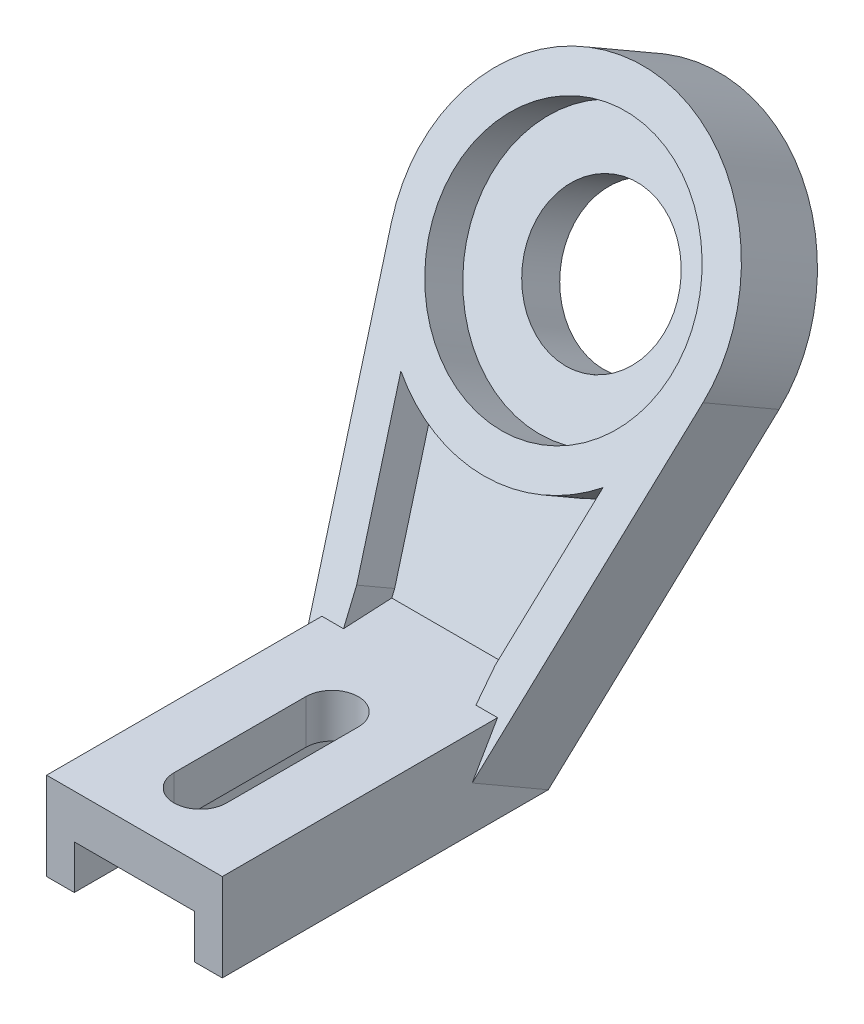
ISO-10303-21;
HEADER;
FILE_DESCRIPTION(('STEP AP214'),'2;1');
FILE_NAME('part.step','',(''),(''),'','','');
FILE_SCHEMA(('AUTOMOTIVE_DESIGN { 1 0 10303 214 1 1 1 1 }'));
ENDSEC;
DATA;
#1=APPLICATION_CONTEXT('core data for automotive mechanical design processes');
#2=APPLICATION_PROTOCOL_DEFINITION('international standard','automotive_design',2000,#1);
#3=PRODUCT_CONTEXT('',#1,'mechanical');
#4=PRODUCT('Part','Part','',(#3));
#5=PRODUCT_RELATED_PRODUCT_CATEGORY('part','',(#4));
#6=PRODUCT_DEFINITION_FORMATION('','',#4);
#7=PRODUCT_DEFINITION_CONTEXT('part definition',#1,'design');
#8=PRODUCT_DEFINITION('design','',#6,#7);
#9=PRODUCT_DEFINITION_SHAPE('','',#8);
#10=(LENGTH_UNIT() NAMED_UNIT(*) SI_UNIT(.MILLI.,.METRE.));
#11=(NAMED_UNIT(*) PLANE_ANGLE_UNIT() SI_UNIT($,.RADIAN.));
#12=(NAMED_UNIT(*) SI_UNIT($,.STERADIAN.) SOLID_ANGLE_UNIT());
#13=UNCERTAINTY_MEASURE_WITH_UNIT(LENGTH_MEASURE(1.E-05),#10,'distance_accuracy_value','');
#14=(GEOMETRIC_REPRESENTATION_CONTEXT(3) GLOBAL_UNCERTAINTY_ASSIGNED_CONTEXT((#13)) GLOBAL_UNIT_ASSIGNED_CONTEXT((#10,
#11,#12)) REPRESENTATION_CONTEXT('',''));
#15=CARTESIAN_POINT('',(0.,0.,0.));
#16=DIRECTION('',(0.,0.,1.));
#17=DIRECTION('',(1.,0.,0.));
#18=AXIS2_PLACEMENT_3D('',#15,#16,#17);
#19=CARTESIAN_POINT('',(-6.35000000000001,29.0838065701559,-38.5253693429844));
#20=DIRECTION('',(0.,-0.500000000000001,-0.866025403784438));
#21=DIRECTION('',(0.,0.866025403784438,-0.500000000000001));
#22=AXIS2_PLACEMENT_3D('',#19,#20,#21);
#23=PLANE('',#22);
#24=CARTESIAN_POINT('',(0.,20.8349145991091,-33.7628693429844));
#25=DIRECTION('',(0.,0.500000000000001,0.866025403784438));
#26=DIRECTION('',(0.,-0.866025403784438,0.500000000000001));
#27=AXIS2_PLACEMENT_3D('',#24,#25,#26);
#28=CIRCLE('',#27,5.15873999999999);
#29=CARTESIAN_POINT('',(0.,16.3673147075902,-31.1834993429844));
#30=VERTEX_POINT('',#29);
#31=EDGE_CURVE('E330',#30,#30,#28,.T.);
#32=ORIENTED_EDGE('',*,*,#31,.F.);
#33=EDGE_LOOP('',(#32));
#34=FACE_BOUND('',#33,.T.);
#35=CARTESIAN_POINT('',(0.,20.8349145991091,-33.7628693429844));
#36=DIRECTION('',(0.,0.500000000000001,0.866025403784438));
#37=DIRECTION('',(0.,-0.866025403784438,0.500000000000001));
#38=AXIS2_PLACEMENT_3D('',#35,#36,#37);
#39=CIRCLE('',#38,8.96874);
#40=CARTESIAN_POINT('',(0.,13.0677579191715,-29.2784993429844));
#41=VERTEX_POINT('',#40);
#42=EDGE_CURVE('E211',#41,#41,#39,.T.);
#43=ORIENTED_EDGE('',*,*,#42,.T.);
#44=EDGE_LOOP('',(#43));
#45=FACE_BOUND('',#44,.T.);
#46=ADVANCED_FACE('F34',(#34,#45),#23,.F.);
#47=CARTESIAN_POINT('',(0.,3.63240390733492,-63.5584918788841));
#48=DIRECTION('',(0.,0.500000000000001,0.866025403784438));
#49=DIRECTION('',(0.,-0.866025403784438,0.500000000000001));
#50=AXIS2_PLACEMENT_3D('',#47,#48,#49);
#51=CYLINDRICAL_SURFACE('',#50,11.50874);
#52=DIRECTION('',(0.,-0.500000000000001,-0.866025403784438));
#53=VECTOR('',#52,1.);
#54=CARTESIAN_POINT('',(-11.2656976899861,30.8205725014422,-11.7618217825945));
#55=LINE('',#54,#53);
#56=CARTESIAN_POINT('',(-11.2656976899861,20.3849249772753,-29.836893504332));
#57=VERTEX_POINT('',#56);
#58=CARTESIAN_POINT('',(-11.2656976899861,17.2099249772753,-35.3361548183632));
#59=VERTEX_POINT('',#58);
#60=EDGE_CURVE('E177',#57,#59,#55,.T.);
#61=ORIENTED_EDGE('',*,*,#60,.F.);
#62=CARTESIAN_POINT('',(0.,22.4224145991091,-31.0132386859688));
#63=DIRECTION('',(0.,0.500000000000001,0.866025403784438));
#64=DIRECTION('',(0.,-0.866025403784438,0.500000000000001));
#65=AXIS2_PLACEMENT_3D('',#62,#63,#64);
#66=CIRCLE('',#65,11.50874);
#67=CARTESIAN_POINT('',(11.2656976899861,20.3849249772753,-29.836893504332));
#68=VERTEX_POINT('',#67);
#69=EDGE_CURVE('E182',#68,#57,#66,.T.);
#70=ORIENTED_EDGE('',*,*,#69,.F.);
#71=DIRECTION('',(0.,-0.500000000000001,-0.866025403784438));
#72=VECTOR('',#71,1.);
#73=CARTESIAN_POINT('',(11.2656976899861,30.8205725014422,-11.7618217825946));
#74=LINE('',#73,#72);
#75=CARTESIAN_POINT('',(11.2656976899861,17.2099249772753,-35.3361548183632));
#76=VERTEX_POINT('',#75);
#77=EDGE_CURVE('E261',#68,#76,#74,.T.);
#78=ORIENTED_EDGE('',*,*,#77,.T.);
#79=CARTESIAN_POINT('',(0.,19.2474145991091,-36.5125));
#80=DIRECTION('',(0.,0.500000000000001,0.866025403784438));
#81=DIRECTION('',(0.,-0.866025403784438,0.500000000000001));
#82=AXIS2_PLACEMENT_3D('',#79,#80,#81);
#83=CIRCLE('',#82,11.50874);
#84=EDGE_CURVE('E183',#59,#76,#83,.F.);
#85=ORIENTED_EDGE('',*,*,#84,.F.);
#86=EDGE_LOOP('',(#61,#70,#78,#85));
#87=FACE_BOUND('',#86,.T.);
#88=ADVANCED_FACE('F179',(#87),#51,.T.);
#89=CARTESIAN_POINT('',(0.,0.,0.));
#90=DIRECTION('',(0.,1.,0.));
#91=DIRECTION('',(0.,0.,1.));
#92=AXIS2_PLACEMENT_3D('',#89,#90,#91);
#93=PLANE('',#92);
#94=DIRECTION('',(0.,0.,-1.));
#95=VECTOR('',#94,1.);
#96=CARTESIAN_POINT('',(1.89865,0.,-14.2875));
#97=LINE('',#96,#95);
#98=CARTESIAN_POINT('',(1.89865,0.,-4.7625));
#99=VERTEX_POINT('',#98);
#100=CARTESIAN_POINT('',(1.89865,0.,-14.2875));
#101=VERTEX_POINT('',#100);
#102=EDGE_CURVE('E308',#99,#101,#97,.T.);
#103=ORIENTED_EDGE('',*,*,#102,.T.);
#104=CARTESIAN_POINT('',(0.,0.,-14.2875));
#105=DIRECTION('',(0.,1.,0.));
#106=DIRECTION('',(0.,0.,1.));
#107=AXIS2_PLACEMENT_3D('',#104,#105,#106);
#108=CIRCLE('',#107,1.89865);
#109=CARTESIAN_POINT('',(-1.89865,0.,-14.2875));
#110=VERTEX_POINT('',#109);
#111=EDGE_CURVE('E298',#101,#110,#108,.T.);
#112=ORIENTED_EDGE('',*,*,#111,.T.);
#113=DIRECTION('',(0.,0.,1.));
#114=VECTOR('',#113,1.);
#115=CARTESIAN_POINT('',(-1.89865,0.,-14.2875));
#116=LINE('',#115,#114);
#117=CARTESIAN_POINT('',(-1.89865,0.,-4.7625));
#118=VERTEX_POINT('',#117);
#119=EDGE_CURVE('E301',#110,#118,#116,.T.);
#120=ORIENTED_EDGE('',*,*,#119,.T.);
#121=CARTESIAN_POINT('',(0.,0.,-4.7625));
#122=DIRECTION('',(0.,1.,0.));
#123=DIRECTION('',(0.,0.,1.));
#124=AXIS2_PLACEMENT_3D('',#121,#122,#123);
#125=CIRCLE('',#124,1.89865);
#126=EDGE_CURVE('E305',#118,#99,#125,.T.);
#127=ORIENTED_EDGE('',*,*,#126,.T.);
#128=EDGE_LOOP('',(#103,#112,#120,#127));
#129=FACE_BOUND('',#128,.T.);
#130=DIRECTION('',(0.,0.,-1.));
#131=VECTOR('',#130,1.);
#132=CARTESIAN_POINT('',(4.34975,0.,0.));
#133=LINE('',#132,#131);
#134=CARTESIAN_POINT('',(4.34975,0.,0.));
#135=VERTEX_POINT('',#134);
#136=CARTESIAN_POINT('',(4.34975,0.,-25.4));
#137=VERTEX_POINT('',#136);
#138=EDGE_CURVE('E287',#135,#137,#133,.T.);
#139=ORIENTED_EDGE('',*,*,#138,.F.);
#140=DIRECTION('',(1.,0.,0.));
#141=VECTOR('',#140,1.);
#142=CARTESIAN_POINT('',(-6.35,0.,0.));
#143=LINE('',#142,#141);
#144=CARTESIAN_POINT('',(-4.34975,0.,0.));
#145=VERTEX_POINT('',#144);
#146=EDGE_CURVE('E342',#145,#135,#143,.T.);
#147=ORIENTED_EDGE('',*,*,#146,.F.);
#148=DIRECTION('',(0.,0.,1.));
#149=VECTOR('',#148,1.);
#150=CARTESIAN_POINT('',(-4.34975,0.,0.));
#151=LINE('',#150,#149);
#152=CARTESIAN_POINT('',(-4.34975,0.,-25.4));
#153=VERTEX_POINT('',#152);
#154=EDGE_CURVE('E292',#153,#145,#151,.T.);
#155=ORIENTED_EDGE('',*,*,#154,.F.);
#156=DIRECTION('',(-1.,0.,0.));
#157=VECTOR('',#156,1.);
#158=CARTESIAN_POINT('',(-6.35,0.,-25.4));
#159=LINE('',#158,#157);
#160=EDGE_CURVE('E337',#137,#153,#159,.T.);
#161=ORIENTED_EDGE('',*,*,#160,.F.);
#162=EDGE_LOOP('',(#139,#147,#155,#161));
#163=FACE_BOUND('',#162,.T.);
#164=ADVANCED_FACE('F370',(#129,#163),#93,.F.);
#165=CARTESIAN_POINT('',(0.,3.175,0.));
#166=DIRECTION('',(0.,1.,0.));
#167=DIRECTION('',(0.,0.,1.));
#168=AXIS2_PLACEMENT_3D('',#165,#166,#167);
#169=PLANE('',#168);
#170=DIRECTION('',(1.,0.,0.));
#171=VECTOR('',#170,1.);
#172=CARTESIAN_POINT('',(0.,3.175,-19.9007386859688));
#173=LINE('',#172,#171);
#174=CARTESIAN_POINT('',(-6.35,3.175,-19.9007386859688));
#175=VERTEX_POINT('',#174);
#176=CARTESIAN_POINT('',(-4.78565932002867,3.175,-19.9007386859688));
#177=VERTEX_POINT('',#176);
#178=EDGE_CURVE('E254',#175,#177,#173,.T.);
#179=ORIENTED_EDGE('',*,*,#178,.F.);
#180=DIRECTION('',(0.,0.,1.));
#181=VECTOR('',#180,1.);
#182=CARTESIAN_POINT('',(-6.35,3.175,-25.4));
#183=LINE('',#182,#181);
#184=CARTESIAN_POINT('',(-6.35,3.175,0.));
#185=VERTEX_POINT('',#184);
#186=EDGE_CURVE('E334',#175,#185,#183,.T.);
#187=ORIENTED_EDGE('',*,*,#186,.T.);
#188=DIRECTION('',(1.,0.,0.));
#189=VECTOR('',#188,1.);
#190=CARTESIAN_POINT('',(-6.35,3.175,0.));
#191=LINE('',#190,#189);
#192=CARTESIAN_POINT('',(6.35,3.175,0.));
#193=VERTEX_POINT('',#192);
#194=EDGE_CURVE('E336',#185,#193,#191,.T.);
#195=ORIENTED_EDGE('',*,*,#194,.T.);
#196=DIRECTION('',(0.,0.,-1.));
#197=VECTOR('',#196,1.);
#198=CARTESIAN_POINT('',(6.34999999999999,3.175,-25.4));
#199=LINE('',#198,#197);
#200=CARTESIAN_POINT('',(6.35,3.175,-19.9007386859688));
#201=VERTEX_POINT('',#200);
#202=EDGE_CURVE('E339',#193,#201,#199,.T.);
#203=ORIENTED_EDGE('',*,*,#202,.T.);
#204=CARTESIAN_POINT('',(4.78565932002866,3.175,-19.9007386859688));
#205=VERTEX_POINT('',#204);
#206=EDGE_CURVE('E56',#205,#201,#173,.T.);
#207=ORIENTED_EDGE('',*,*,#206,.F.);
#208=DIRECTION('',(0.0479288249038852,0.,-0.998850753487893));
#209=VECTOR('',#208,1.);
#210=CARTESIAN_POINT('',(3.8219429894529,3.175,0.18339199894926));
#211=LINE('',#210,#209);
#212=CARTESIAN_POINT('',(4.96157691445774,3.17499999999999,-23.5669128953229));
#213=VERTEX_POINT('',#212);
#214=EDGE_CURVE('E249',#205,#213,#211,.T.);
#215=ORIENTED_EDGE('',*,*,#214,.T.);
#216=DIRECTION('',(-1.,0.,0.));
#217=VECTOR('',#216,1.);
#218=CARTESIAN_POINT('',(0.,3.175,-23.5669128953229));
#219=LINE('',#218,#217);
#220=CARTESIAN_POINT('',(-4.96157691445776,3.17499999999999,-23.5669128953229));
#221=VERTEX_POINT('',#220);
#222=EDGE_CURVE('E352',#213,#221,#219,.T.);
#223=ORIENTED_EDGE('',*,*,#222,.T.);
#224=DIRECTION('',(0.0479288249038846,0.,0.998850753487894));
#225=VECTOR('',#224,1.);
#226=CARTESIAN_POINT('',(-3.82194298945292,3.175,0.183391998949259));
#227=LINE('',#226,#225);
#228=EDGE_CURVE('E49',#221,#177,#227,.T.);
#229=ORIENTED_EDGE('',*,*,#228,.T.);
#230=EDGE_LOOP('',(#179,#187,#195,#203,#207,#215,#223,#229));
#231=FACE_BOUND('',#230,.T.);
#232=CARTESIAN_POINT('',(0.,3.175,-14.2875));
#233=DIRECTION('',(0.,1.,0.));
#234=DIRECTION('',(0.,0.,1.));
#235=AXIS2_PLACEMENT_3D('',#232,#233,#234);
#236=CIRCLE('',#235,1.89865);
#237=CARTESIAN_POINT('',(1.89865,3.175,-14.2875));
#238=VERTEX_POINT('',#237);
#239=CARTESIAN_POINT('',(-1.89865,3.175,-14.2875));
#240=VERTEX_POINT('',#239);
#241=EDGE_CURVE('E297',#238,#240,#236,.T.);
#242=ORIENTED_EDGE('',*,*,#241,.F.);
#243=DIRECTION('',(0.,0.,-1.));
#244=VECTOR('',#243,1.);
#245=CARTESIAN_POINT('',(1.89865,3.175,-14.2875));
#246=LINE('',#245,#244);
#247=CARTESIAN_POINT('',(1.89865,3.175,-4.7625));
#248=VERTEX_POINT('',#247);
#249=EDGE_CURVE('E302',#248,#238,#246,.T.);
#250=ORIENTED_EDGE('',*,*,#249,.F.);
#251=CARTESIAN_POINT('',(0.,3.175,-4.7625));
#252=DIRECTION('',(0.,1.,0.));
#253=DIRECTION('',(0.,0.,1.));
#254=AXIS2_PLACEMENT_3D('',#251,#252,#253);
#255=CIRCLE('',#254,1.89865);
#256=CARTESIAN_POINT('',(-1.89865,3.175,-4.7625));
#257=VERTEX_POINT('',#256);
#258=EDGE_CURVE('E316',#257,#248,#255,.T.);
#259=ORIENTED_EDGE('',*,*,#258,.F.);
#260=DIRECTION('',(0.,0.,1.));
#261=VECTOR('',#260,1.);
#262=CARTESIAN_POINT('',(-1.89865,3.175,-14.2875));
#263=LINE('',#262,#261);
#264=EDGE_CURVE('E313',#240,#257,#263,.T.);
#265=ORIENTED_EDGE('',*,*,#264,.F.);
#266=EDGE_LOOP('',(#242,#250,#259,#265));
#267=FACE_BOUND('',#266,.T.);
#268=ADVANCED_FACE('F423',(#231,#267),#169,.T.);
#269=CARTESIAN_POINT('',(-6.35,3.175,-25.4));
#270=DIRECTION('',(1.,0.,0.));
#271=DIRECTION('',(0.,0.,-1.));
#272=AXIS2_PLACEMENT_3D('',#269,#270,#271);
#273=PLANE('',#272);
#274=ORIENTED_EDGE('',*,*,#186,.F.);
#275=DIRECTION('',(0.,-0.866025403784438,0.500000000000001));
#276=VECTOR('',#275,1.);
#277=CARTESIAN_POINT('',(-6.35,5.55625000000001,-21.2755540144766));
#278=LINE('',#277,#276);
#279=CARTESIAN_POINT('',(-6.35,0.,-18.0676515812918));
#280=VERTEX_POINT('',#279);
#281=EDGE_CURVE('E253',#175,#280,#278,.T.);
#282=ORIENTED_EDGE('',*,*,#281,.T.);
#283=DIRECTION('',(0.,-0.500000000000001,-0.866025403784438));
#284=VECTOR('',#283,1.);
#285=CARTESIAN_POINT('',(-6.34999999999999,10.435647524167,0.0074201404456839));
#286=LINE('',#285,#284);
#287=CARTESIAN_POINT('',(-6.35,-3.17499999999999,-23.5669128953229));
#288=VERTEX_POINT('',#287);
#289=EDGE_CURVE('E188',#280,#288,#286,.T.);
#290=ORIENTED_EDGE('',*,*,#289,.T.);
#291=DIRECTION('',(0.,0.,1.));
#292=VECTOR('',#291,1.);
#293=CARTESIAN_POINT('',(-6.35,-3.175,-25.4));
#294=LINE('',#293,#292);
#295=CARTESIAN_POINT('',(-6.35,-3.175,0.));
#296=VERTEX_POINT('',#295);
#297=EDGE_CURVE('E284',#288,#296,#294,.T.);
#298=ORIENTED_EDGE('',*,*,#297,.T.);
#299=DIRECTION('',(0.,-1.,0.));
#300=VECTOR('',#299,1.);
#301=CARTESIAN_POINT('',(-6.35,3.175,0.));
#302=LINE('',#301,#300);
#303=EDGE_CURVE('E349',#185,#296,#302,.T.);
#304=ORIENTED_EDGE('',*,*,#303,.F.);
#305=EDGE_LOOP('',(#274,#282,#290,#298,#304));
#306=FACE_BOUND('',#305,.T.);
#307=ADVANCED_FACE('F36',(#306),#273,.F.);
#308=CARTESIAN_POINT('',(-6.35,3.175,0.));
#309=DIRECTION('',(0.,0.,-1.));
#310=DIRECTION('',(-1.,0.,0.));
#311=AXIS2_PLACEMENT_3D('',#308,#309,#310);
#312=PLANE('',#311);
#313=ORIENTED_EDGE('',*,*,#303,.T.);
#314=DIRECTION('',(1.,0.,0.));
#315=VECTOR('',#314,1.);
#316=CARTESIAN_POINT('',(-11.50874,-3.175,0.));
#317=LINE('',#316,#315);
#318=CARTESIAN_POINT('',(-4.34975,-3.175,0.));
#319=VERTEX_POINT('',#318);
#320=EDGE_CURVE('E269',#296,#319,#317,.T.);
#321=ORIENTED_EDGE('',*,*,#320,.T.);
#322=DIRECTION('',(0.,1.,0.));
#323=VECTOR('',#322,1.);
#324=CARTESIAN_POINT('',(-4.34975,-18.034,0.));
#325=LINE('',#324,#323);
#326=EDGE_CURVE('E295',#319,#145,#325,.T.);
#327=ORIENTED_EDGE('',*,*,#326,.T.);
#328=ORIENTED_EDGE('',*,*,#146,.T.);
#329=DIRECTION('',(0.,1.,0.));
#330=VECTOR('',#329,1.);
#331=CARTESIAN_POINT('',(4.34975,-18.034,0.));
#332=LINE('',#331,#330);
#333=CARTESIAN_POINT('',(4.34975,-3.175,0.));
#334=VERTEX_POINT('',#333);
#335=EDGE_CURVE('E290',#334,#135,#332,.T.);
#336=ORIENTED_EDGE('',*,*,#335,.F.);
#337=CARTESIAN_POINT('',(6.35,-3.175,0.));
#338=VERTEX_POINT('',#337);
#339=EDGE_CURVE('E266',#334,#338,#317,.T.);
#340=ORIENTED_EDGE('',*,*,#339,.T.);
#341=DIRECTION('',(0.,-1.,0.));
#342=VECTOR('',#341,1.);
#343=CARTESIAN_POINT('',(6.35,3.175,0.));
#344=LINE('',#343,#342);
#345=EDGE_CURVE('E341',#193,#338,#344,.T.);
#346=ORIENTED_EDGE('',*,*,#345,.F.);
#347=ORIENTED_EDGE('',*,*,#194,.F.);
#348=EDGE_LOOP('',(#313,#321,#327,#328,#336,#340,#346,#347));
#349=FACE_BOUND('',#348,.T.);
#350=ADVANCED_FACE('F363',(#349),#312,.F.);
#351=CARTESIAN_POINT('',(6.34999999999999,3.175,-25.4));
#352=DIRECTION('',(-1.,0.,0.));
#353=DIRECTION('',(0.,0.,1.));
#354=AXIS2_PLACEMENT_3D('',#351,#352,#353);
#355=PLANE('',#354);
#356=DIRECTION('',(0.,-0.500000000000001,-0.866025403784438));
#357=VECTOR('',#356,1.);
#358=CARTESIAN_POINT('',(6.35000000000001,10.435647524167,0.00742014044568043));
#359=LINE('',#358,#357);
#360=CARTESIAN_POINT('',(6.35,0.,-18.0676515812918));
#361=VERTEX_POINT('',#360);
#362=CARTESIAN_POINT('',(6.35,-3.17499999999999,-23.5669128953229));
#363=VERTEX_POINT('',#362);
#364=EDGE_CURVE('E262',#361,#363,#359,.T.);
#365=ORIENTED_EDGE('',*,*,#364,.F.);
#366=DIRECTION('',(0.,0.866025403784438,-0.500000000000001));
#367=VECTOR('',#366,1.);
#368=CARTESIAN_POINT('',(6.35,5.55625000000001,-21.2755540144766));
#369=LINE('',#368,#367);
#370=EDGE_CURVE('E11',#361,#201,#369,.T.);
#371=ORIENTED_EDGE('',*,*,#370,.T.);
#372=ORIENTED_EDGE('',*,*,#202,.F.);
#373=ORIENTED_EDGE('',*,*,#345,.T.);
#374=DIRECTION('',(0.,0.,-1.));
#375=VECTOR('',#374,1.);
#376=CARTESIAN_POINT('',(6.34999999999999,-3.175,-25.4));
#377=LINE('',#376,#375);
#378=EDGE_CURVE('E281',#338,#363,#377,.T.);
#379=ORIENTED_EDGE('',*,*,#378,.T.);
#380=EDGE_LOOP('',(#365,#371,#372,#373,#379));
#381=FACE_BOUND('',#380,.T.);
#382=ADVANCED_FACE('F381',(#381),#355,.F.);
#383=DIRECTION('',(-0.0955290449744114,0.862064760429695,-0.497713321492975));
#384=VECTOR('',#383,1.);
#385=CARTESIAN_POINT('',(-5.01082985693095,3.61946404823775,-23.8235243332181));
#386=LINE('',#385,#384);
#387=CARTESIAN_POINT('',(-5.01082985693095,3.61946404823776,-23.8235243332181));
#388=VERTEX_POINT('',#387);
#389=EDGE_CURVE('E226',#221,#388,#386,.T.);
#390=ORIENTED_EDGE('',*,*,#389,.F.);
#391=ORIENTED_EDGE('',*,*,#222,.F.);
#392=DIRECTION('',(-0.0955290449744137,-0.862064760429694,0.497713321492976));
#393=VECTOR('',#392,1.);
#394=CARTESIAN_POINT('',(4.47147286107701,-1.24775366069505,-21.0134348787612));
#395=LINE('',#394,#393);
#396=CARTESIAN_POINT('',(5.01082985693094,3.61946404823775,-23.8235243332181));
#397=VERTEX_POINT('',#396);
#398=EDGE_CURVE('E205',#397,#213,#395,.T.);
#399=ORIENTED_EDGE('',*,*,#398,.F.);
#400=DIRECTION('',(-0.204426406650398,-0.847736623721073,0.489440967907267));
#401=VECTOR('',#400,1.);
#402=CARTESIAN_POINT('',(5.01082985693095,3.61946404823775,-23.8235243332181));
#403=LINE('',#402,#401);
#404=CARTESIAN_POINT('',(7.30501638045674,13.1332346491473,-29.3163023506616));
#405=VERTEX_POINT('',#404);
#406=EDGE_CURVE('E208',#405,#397,#403,.T.);
#407=ORIENTED_EDGE('',*,*,#406,.F.);
#408=CARTESIAN_POINT('',(0.,20.8349145991091,-33.7628693429844));
#409=DIRECTION('',(0.,0.500000000000001,0.866025403784438));
#410=DIRECTION('',(0.,-0.866025403784438,0.500000000000001));
#411=AXIS2_PLACEMENT_3D('',#408,#409,#410);
#412=CIRCLE('',#411,11.50874);
#413=CARTESIAN_POINT('',(-7.30501638045675,13.1332346491473,-29.3163023506616));
#414=VERTEX_POINT('',#413);
#415=EDGE_CURVE('E233',#414,#405,#412,.T.);
#416=ORIENTED_EDGE('',*,*,#415,.F.);
#417=DIRECTION('',(-0.204426406650398,0.847736623721073,-0.489440967907267));
#418=VECTOR('',#417,1.);
#419=CARTESIAN_POINT('',(-7.30501638045675,13.1332346491473,-29.3163023506616));
#420=LINE('',#419,#418);
#421=EDGE_CURVE('E229',#388,#414,#420,.T.);
#422=ORIENTED_EDGE('',*,*,#421,.F.);
#423=EDGE_LOOP('',(#390,#391,#399,#407,#416,#422));
#424=FACE_BOUND('',#423,.T.);
#425=ADVANCED_FACE('F403',(#424),#23,.F.);
#426=CARTESIAN_POINT('',(-6.35000000000001,27.4963065701559,-41.275));
#427=DIRECTION('',(0.,0.500000000000001,0.866025403784438));
#428=DIRECTION('',(0.,-0.866025403784438,0.500000000000001));
#429=AXIS2_PLACEMENT_3D('',#426,#427,#428);
#430=PLANE('',#429);
#431=DIRECTION('',(-0.204426406650398,0.847736623721073,-0.489440967907267));
#432=VECTOR('',#431,1.);
#433=CARTESIAN_POINT('',(-6.35,-3.17499999999999,-23.5669128953229));
#434=LINE('',#433,#432);
#435=EDGE_CURVE('E256',#288,#59,#434,.T.);
#436=ORIENTED_EDGE('',*,*,#435,.T.);
#437=ORIENTED_EDGE('',*,*,#84,.T.);
#438=DIRECTION('',(-0.204426406650398,-0.847736623721073,0.489440967907267));
#439=VECTOR('',#438,1.);
#440=CARTESIAN_POINT('',(6.35,-3.17499999999999,-23.5669128953229));
#441=LINE('',#440,#439);
#442=EDGE_CURVE('E187',#76,#363,#441,.T.);
#443=ORIENTED_EDGE('',*,*,#442,.T.);
#444=DIRECTION('',(1.,0.,0.));
#445=VECTOR('',#444,1.);
#446=CARTESIAN_POINT('',(-11.50874,-3.175,-23.566912895323));
#447=LINE('',#446,#445);
#448=CARTESIAN_POINT('',(4.34975,-3.175,-23.566912895323));
#449=VERTEX_POINT('',#448);
#450=EDGE_CURVE('E264',#449,#363,#447,.T.);
#451=ORIENTED_EDGE('',*,*,#450,.F.);
#452=DIRECTION('',(0.,-0.866025403784441,0.499999999999995));
#453=VECTOR('',#452,1.);
#454=CARTESIAN_POINT('',(4.34975,-24.5240226280624,-11.2410489340759));
#455=LINE('',#454,#453);
#456=EDGE_CURVE('E273',#137,#449,#455,.T.);
#457=ORIENTED_EDGE('',*,*,#456,.F.);
#458=ORIENTED_EDGE('',*,*,#160,.T.);
#459=DIRECTION('',(0.,0.866025403784441,-0.499999999999995));
#460=VECTOR('',#459,1.);
#461=CARTESIAN_POINT('',(-4.34975,-24.5240226280624,-11.2410489340759));
#462=LINE('',#461,#460);
#463=CARTESIAN_POINT('',(-4.34975,-3.175,-23.566912895323));
#464=VERTEX_POINT('',#463);
#465=EDGE_CURVE('E276',#464,#153,#462,.T.);
#466=ORIENTED_EDGE('',*,*,#465,.F.);
#467=EDGE_CURVE('E270',#288,#464,#447,.T.);
#468=ORIENTED_EDGE('',*,*,#467,.F.);
#469=EDGE_LOOP('',(#436,#437,#443,#451,#457,#458,#466,#468));
#470=FACE_BOUND('',#469,.T.);
#471=CARTESIAN_POINT('',(0.,19.2474145991091,-36.5125));
#472=DIRECTION('',(0.,0.500000000000001,0.866025403784438));
#473=DIRECTION('',(0.,-0.866025403784438,0.500000000000001));
#474=AXIS2_PLACEMENT_3D('',#471,#472,#473);
#475=CIRCLE('',#474,5.15873999999999);
#476=CARTESIAN_POINT('',(0.,14.7798147075902,-33.93313));
#477=VERTEX_POINT('',#476);
#478=EDGE_CURVE('E333',#477,#477,#475,.T.);
#479=ORIENTED_EDGE('',*,*,#478,.T.);
#480=EDGE_LOOP('',(#479));
#481=FACE_BOUND('',#480,.T.);
#482=ADVANCED_FACE('F376',(#470,#481),#430,.F.);
#483=CARTESIAN_POINT('',(0.,20.8349145991091,-33.7628693429844));
#484=DIRECTION('',(0.,0.500000000000001,0.866025403784438));
#485=DIRECTION('',(0.,-0.866025403784438,0.500000000000001));
#486=AXIS2_PLACEMENT_3D('',#483,#484,#485);
#487=CYLINDRICAL_SURFACE('',#486,5.15873999999999);
#488=ORIENTED_EDGE('',*,*,#31,.T.);
#489=EDGE_LOOP('',(#488));
#490=FACE_BOUND('',#489,.T.);
#491=ORIENTED_EDGE('',*,*,#478,.F.);
#492=EDGE_LOOP('',(#491));
#493=FACE_BOUND('',#492,.T.);
#494=ADVANCED_FACE('F418',(#490,#493),#487,.F.);
#495=CARTESIAN_POINT('',(0.,0.,-14.2875));
#496=DIRECTION('',(0.,1.,0.));
#497=DIRECTION('',(0.,0.,1.));
#498=AXIS2_PLACEMENT_3D('',#495,#496,#497);
#499=CYLINDRICAL_SURFACE('',#498,1.89865);
#500=ORIENTED_EDGE('',*,*,#241,.T.);
#501=DIRECTION('',(0.,1.,0.));
#502=VECTOR('',#501,1.);
#503=CARTESIAN_POINT('',(-1.89865,0.,-14.2875));
#504=LINE('',#503,#502);
#505=EDGE_CURVE('E311',#110,#240,#504,.T.);
#506=ORIENTED_EDGE('',*,*,#505,.F.);
#507=ORIENTED_EDGE('',*,*,#111,.F.);
#508=DIRECTION('',(0.,1.,0.));
#509=VECTOR('',#508,1.);
#510=CARTESIAN_POINT('',(1.89865,0.,-14.2875));
#511=LINE('',#510,#509);
#512=EDGE_CURVE('E321',#101,#238,#511,.T.);
#513=ORIENTED_EDGE('',*,*,#512,.T.);
#514=EDGE_LOOP('',(#500,#506,#507,#513));
#515=FACE_BOUND('',#514,.T.);
#516=ADVANCED_FACE('F599',(#515),#499,.F.);
#517=CARTESIAN_POINT('',(1.89865,0.,-14.2875));
#518=DIRECTION('',(1.,0.,0.));
#519=DIRECTION('',(0.,0.,-1.));
#520=AXIS2_PLACEMENT_3D('',#517,#518,#519);
#521=PLANE('',#520);
#522=ORIENTED_EDGE('',*,*,#249,.T.);
#523=ORIENTED_EDGE('',*,*,#512,.F.);
#524=ORIENTED_EDGE('',*,*,#102,.F.);
#525=DIRECTION('',(0.,1.,0.));
#526=VECTOR('',#525,1.);
#527=CARTESIAN_POINT('',(1.89865,0.,-4.7625));
#528=LINE('',#527,#526);
#529=EDGE_CURVE('E323',#99,#248,#528,.T.);
#530=ORIENTED_EDGE('',*,*,#529,.T.);
#531=EDGE_LOOP('',(#522,#523,#524,#530));
#532=FACE_BOUND('',#531,.T.);
#533=ADVANCED_FACE('F589',(#532),#521,.F.);
#534=CARTESIAN_POINT('',(0.,0.,-4.7625));
#535=DIRECTION('',(0.,1.,0.));
#536=DIRECTION('',(0.,0.,1.));
#537=AXIS2_PLACEMENT_3D('',#534,#535,#536);
#538=CYLINDRICAL_SURFACE('',#537,1.89865);
#539=ORIENTED_EDGE('',*,*,#258,.T.);
#540=ORIENTED_EDGE('',*,*,#529,.F.);
#541=ORIENTED_EDGE('',*,*,#126,.F.);
#542=DIRECTION('',(0.,1.,0.));
#543=VECTOR('',#542,1.);
#544=CARTESIAN_POINT('',(-1.89865,0.,-4.7625));
#545=LINE('',#544,#543);
#546=EDGE_CURVE('E325',#118,#257,#545,.T.);
#547=ORIENTED_EDGE('',*,*,#546,.T.);
#548=EDGE_LOOP('',(#539,#540,#541,#547));
#549=FACE_BOUND('',#548,.T.);
#550=ADVANCED_FACE('F579',(#549),#538,.F.);
#551=CARTESIAN_POINT('',(-1.89865,0.,-14.2875));
#552=DIRECTION('',(-1.,0.,0.));
#553=DIRECTION('',(0.,0.,1.));
#554=AXIS2_PLACEMENT_3D('',#551,#552,#553);
#555=PLANE('',#554);
#556=ORIENTED_EDGE('',*,*,#264,.T.);
#557=ORIENTED_EDGE('',*,*,#546,.F.);
#558=ORIENTED_EDGE('',*,*,#119,.F.);
#559=ORIENTED_EDGE('',*,*,#505,.T.);
#560=EDGE_LOOP('',(#556,#557,#558,#559));
#561=FACE_BOUND('',#560,.T.);
#562=ADVANCED_FACE('F558',(#561),#555,.F.);
#563=CARTESIAN_POINT('',(-4.34975,-18.034,0.));
#564=DIRECTION('',(-1.,0.,0.));
#565=DIRECTION('',(0.,0.,1.));
#566=AXIS2_PLACEMENT_3D('',#563,#564,#565);
#567=PLANE('',#566);
#568=ORIENTED_EDGE('',*,*,#326,.F.);
#569=DIRECTION('',(0.,0.,-1.));
#570=VECTOR('',#569,1.);
#571=CARTESIAN_POINT('',(-4.34975,-3.175,0.));
#572=LINE('',#571,#570);
#573=EDGE_CURVE('E278',#319,#464,#572,.T.);
#574=ORIENTED_EDGE('',*,*,#573,.T.);
#575=ORIENTED_EDGE('',*,*,#465,.T.);
#576=ORIENTED_EDGE('',*,*,#154,.T.);
#577=EDGE_LOOP('',(#568,#574,#575,#576));
#578=FACE_BOUND('',#577,.T.);
#579=ADVANCED_FACE('F373',(#578),#567,.F.);
#580=CARTESIAN_POINT('',(4.34975,-18.034,0.));
#581=DIRECTION('',(1.,0.,0.));
#582=DIRECTION('',(0.,0.,-1.));
#583=AXIS2_PLACEMENT_3D('',#580,#581,#582);
#584=PLANE('',#583);
#585=ORIENTED_EDGE('',*,*,#456,.T.);
#586=DIRECTION('',(0.,0.,1.));
#587=VECTOR('',#586,1.);
#588=CARTESIAN_POINT('',(4.34975,-3.175,0.));
#589=LINE('',#588,#587);
#590=EDGE_CURVE('E42',#449,#334,#589,.T.);
#591=ORIENTED_EDGE('',*,*,#590,.T.);
#592=ORIENTED_EDGE('',*,*,#335,.T.);
#593=ORIENTED_EDGE('',*,*,#138,.T.);
#594=EDGE_LOOP('',(#585,#591,#592,#593));
#595=FACE_BOUND('',#594,.T.);
#596=ADVANCED_FACE('F358',(#595),#584,.F.);
#597=CARTESIAN_POINT('',(-11.50874,-3.175,0.));
#598=DIRECTION('',(0.,1.,0.));
#599=DIRECTION('',(0.,0.,1.));
#600=AXIS2_PLACEMENT_3D('',#597,#598,#599);
#601=PLANE('',#600);
#602=ORIENTED_EDGE('',*,*,#339,.F.);
#603=ORIENTED_EDGE('',*,*,#590,.F.);
#604=ORIENTED_EDGE('',*,*,#450,.T.);
#605=ORIENTED_EDGE('',*,*,#378,.F.);
#606=EDGE_LOOP('',(#602,#603,#604,#605));
#607=FACE_BOUND('',#606,.T.);
#608=ADVANCED_FACE('F379',(#607),#601,.F.);
#609=ORIENTED_EDGE('',*,*,#467,.T.);
#610=ORIENTED_EDGE('',*,*,#573,.F.);
#611=ORIENTED_EDGE('',*,*,#320,.F.);
#612=ORIENTED_EDGE('',*,*,#297,.F.);
#613=EDGE_LOOP('',(#609,#610,#611,#612));
#614=FACE_BOUND('',#613,.T.);
#615=ADVANCED_FACE('F389',(#614),#601,.F.);
#616=CARTESIAN_POINT('',(6.35000000000001,10.435647524167,0.00742014044568043));
#617=DIRECTION('',(0.978881935814532,-0.177038461363613,0.102213203325199));
#618=DIRECTION('',(0.177970579621201,0.984035808692597,0.));
#619=AXIS2_PLACEMENT_3D('',#616,#617,#618);
#620=PLANE('',#619);
#621=ORIENTED_EDGE('',*,*,#77,.F.);
#622=DIRECTION('',(0.204426406650398,0.847736623721073,-0.489440967907267));
#623=VECTOR('',#622,1.);
#624=CARTESIAN_POINT('',(6.35,0.,-18.0676515812918));
#625=LINE('',#624,#623);
#626=EDGE_CURVE('E204',#361,#68,#625,.T.);
#627=ORIENTED_EDGE('',*,*,#626,.F.);
#628=ORIENTED_EDGE('',*,*,#364,.T.);
#629=ORIENTED_EDGE('',*,*,#442,.F.);
#630=EDGE_LOOP('',(#621,#627,#628,#629));
#631=FACE_BOUND('',#630,.T.);
#632=ADVANCED_FACE('F391',(#631),#620,.T.);
#633=CARTESIAN_POINT('',(-6.34999999999999,10.435647524167,0.0074201404456839));
#634=DIRECTION('',(-0.978881935814532,-0.177038461363613,0.1022132033252));
#635=DIRECTION('',(0.177970579621201,-0.984035808692597,0.));
#636=AXIS2_PLACEMENT_3D('',#633,#634,#635);
#637=PLANE('',#636);
#638=ORIENTED_EDGE('',*,*,#289,.F.);
#639=DIRECTION('',(0.204426406650398,-0.847736623721073,0.489440967907267));
#640=VECTOR('',#639,1.);
#641=CARTESIAN_POINT('',(-11.2656976899861,20.3849249772753,-29.836893504332));
#642=LINE('',#641,#640);
#643=EDGE_CURVE('E191',#57,#280,#642,.T.);
#644=ORIENTED_EDGE('',*,*,#643,.F.);
#645=ORIENTED_EDGE('',*,*,#60,.T.);
#646=ORIENTED_EDGE('',*,*,#435,.F.);
#647=EDGE_LOOP('',(#638,#644,#645,#646));
#648=FACE_BOUND('',#647,.T.);
#649=ADVANCED_FACE('F192',(#648),#637,.T.);
#650=CARTESIAN_POINT('',(0.,22.4224145991091,-31.0132386859688));
#651=DIRECTION('',(0.,0.500000000000001,0.866025403784438));
#652=DIRECTION('',(0.,-0.866025403784438,0.500000000000001));
#653=AXIS2_PLACEMENT_3D('',#650,#651,#652);
#654=PLANE('',#653);
#655=ORIENTED_EDGE('',*,*,#281,.F.);
#656=ORIENTED_EDGE('',*,*,#178,.T.);
#657=DIRECTION('',(-0.0955290449744114,0.862064760429695,-0.497713321492975));
#658=VECTOR('',#657,1.);
#659=CARTESIAN_POINT('',(-5.01082985693095,5.20696404823776,-21.0738936762025));
#660=LINE('',#659,#658);
#661=CARTESIAN_POINT('',(-5.01082985693095,5.20696404823776,-21.0738936762025));
#662=VERTEX_POINT('',#661);
#663=EDGE_CURVE('E197',#177,#662,#660,.T.);
#664=ORIENTED_EDGE('',*,*,#663,.T.);
#665=DIRECTION('',(-0.204426406650398,0.847736623721073,-0.489440967907267));
#666=VECTOR('',#665,1.);
#667=CARTESIAN_POINT('',(-7.30501638045675,14.7207346491473,-26.566671693646));
#668=LINE('',#667,#666);
#669=CARTESIAN_POINT('',(-7.30501638045675,14.7207346491473,-26.566671693646));
#670=VERTEX_POINT('',#669);
#671=EDGE_CURVE('E215',#662,#670,#668,.T.);
#672=ORIENTED_EDGE('',*,*,#671,.T.);
#673=CARTESIAN_POINT('',(0.,22.4224145991091,-31.0132386859688));
#674=DIRECTION('',(0.,0.500000000000001,0.866025403784438));
#675=DIRECTION('',(0.,-0.866025403784438,0.500000000000001));
#676=AXIS2_PLACEMENT_3D('',#673,#674,#675);
#677=CIRCLE('',#676,11.50874);
#678=CARTESIAN_POINT('',(7.30501638045674,14.7207346491473,-26.566671693646));
#679=VERTEX_POINT('',#678);
#680=EDGE_CURVE('E217',#670,#679,#677,.T.);
#681=ORIENTED_EDGE('',*,*,#680,.T.);
#682=DIRECTION('',(-0.204426406650398,-0.847736623721073,0.489440967907267));
#683=VECTOR('',#682,1.);
#684=CARTESIAN_POINT('',(5.01082985693095,5.20696404823776,-21.0738936762025));
#685=LINE('',#684,#683);
#686=CARTESIAN_POINT('',(5.01082985693095,5.20696404823776,-21.0738936762025));
#687=VERTEX_POINT('',#686);
#688=EDGE_CURVE('E219',#679,#687,#685,.T.);
#689=ORIENTED_EDGE('',*,*,#688,.T.);
#690=DIRECTION('',(-0.0955290449744137,-0.862064760429694,0.497713321492976));
#691=VECTOR('',#690,1.);
#692=CARTESIAN_POINT('',(4.47147286107701,0.339746339304952,-18.2638042217456));
#693=LINE('',#692,#691);
#694=EDGE_CURVE('E221',#687,#205,#693,.T.);
#695=ORIENTED_EDGE('',*,*,#694,.T.);
#696=ORIENTED_EDGE('',*,*,#206,.T.);
#697=ORIENTED_EDGE('',*,*,#370,.F.);
#698=ORIENTED_EDGE('',*,*,#626,.T.);
#699=ORIENTED_EDGE('',*,*,#69,.T.);
#700=ORIENTED_EDGE('',*,*,#643,.T.);
#701=EDGE_LOOP('',(#655,#656,#664,#672,#681,#689,#695,#696,#697,#698,#699,#700));
#702=FACE_BOUND('',#701,.T.);
#703=CARTESIAN_POINT('',(0.,22.4224145991091,-31.0132386859688));
#704=DIRECTION('',(0.,0.500000000000001,0.866025403784438));
#705=DIRECTION('',(0.,-0.866025403784438,0.500000000000001));
#706=AXIS2_PLACEMENT_3D('',#703,#704,#705);
#707=CIRCLE('',#706,8.96874);
#708=CARTESIAN_POINT('',(0.,14.6552579191715,-26.5288686859688));
#709=VERTEX_POINT('',#708);
#710=EDGE_CURVE('E230',#709,#709,#707,.T.);
#711=ORIENTED_EDGE('',*,*,#710,.F.);
#712=EDGE_LOOP('',(#711));
#713=FACE_BOUND('',#712,.T.);
#714=ADVANCED_FACE('F200',(#702,#713),#654,.T.);
#715=CARTESIAN_POINT('',(-5.01082985693095,5.20696404823776,-21.0738936762025));
#716=DIRECTION('',(-0.995426642985949,-0.0827305797471062,0.0477645224872061));
#717=DIRECTION('',(0.0828251143592447,-0.996564097502704,0.));
#718=AXIS2_PLACEMENT_3D('',#715,#716,#717);
#719=PLANE('',#718);
#720=ORIENTED_EDGE('',*,*,#228,.F.);
#721=ORIENTED_EDGE('',*,*,#389,.T.);
#722=DIRECTION('',(0.,-0.500000000000001,-0.866025403784438));
#723=VECTOR('',#722,1.);
#724=CARTESIAN_POINT('',(-5.01082985693095,5.20696404823776,-21.0738936762025));
#725=LINE('',#724,#723);
#726=EDGE_CURVE('E246',#662,#388,#725,.T.);
#727=ORIENTED_EDGE('',*,*,#726,.F.);
#728=ORIENTED_EDGE('',*,*,#663,.F.);
#729=EDGE_LOOP('',(#720,#721,#727,#728));
#730=FACE_BOUND('',#729,.T.);
#731=ADVANCED_FACE('F426',(#730),#719,.F.);
#732=CARTESIAN_POINT('',(-7.30501638045675,14.7207346491473,-26.566671693646));
#733=DIRECTION('',(-0.978881935814532,-0.177038461363613,0.1022132033252));
#734=DIRECTION('',(0.177970579621201,-0.984035808692597,0.));
#735=AXIS2_PLACEMENT_3D('',#732,#733,#734);
#736=PLANE('',#735);
#737=ORIENTED_EDGE('',*,*,#421,.T.);
#738=DIRECTION('',(0.,-0.500000000000001,-0.866025403784438));
#739=VECTOR('',#738,1.);
#740=CARTESIAN_POINT('',(-7.30501638045675,14.7207346491473,-26.566671693646));
#741=LINE('',#740,#739);
#742=EDGE_CURVE('E243',#670,#414,#741,.T.);
#743=ORIENTED_EDGE('',*,*,#742,.F.);
#744=ORIENTED_EDGE('',*,*,#671,.F.);
#745=ORIENTED_EDGE('',*,*,#726,.T.);
#746=EDGE_LOOP('',(#737,#743,#744,#745));
#747=FACE_BOUND('',#746,.T.);
#748=ADVANCED_FACE('F432',(#747),#736,.F.);
#749=CARTESIAN_POINT('',(0.,22.4224145991091,-31.0132386859688));
#750=DIRECTION('',(0.,-0.500000000000001,-0.866025403784438));
#751=DIRECTION('',(0.,0.866025403784438,-0.500000000000001));
#752=AXIS2_PLACEMENT_3D('',#749,#750,#751);
#753=CYLINDRICAL_SURFACE('',#752,11.50874);
#754=ORIENTED_EDGE('',*,*,#415,.T.);
#755=DIRECTION('',(0.,-0.500000000000001,-0.866025403784438));
#756=VECTOR('',#755,1.);
#757=CARTESIAN_POINT('',(7.30501638045674,14.7207346491473,-26.566671693646));
#758=LINE('',#757,#756);
#759=EDGE_CURVE('E240',#679,#405,#758,.T.);
#760=ORIENTED_EDGE('',*,*,#759,.F.);
#761=ORIENTED_EDGE('',*,*,#680,.F.);
#762=ORIENTED_EDGE('',*,*,#742,.T.);
#763=EDGE_LOOP('',(#754,#760,#761,#762));
#764=FACE_BOUND('',#763,.T.);
#765=ADVANCED_FACE('F434',(#764),#753,.T.);
#766=CARTESIAN_POINT('',(5.01082985693095,5.20696404823776,-21.0738936762025));
#767=DIRECTION('',(0.978881935814532,-0.177038461363613,0.102213203325199));
#768=DIRECTION('',(0.177970579621201,0.984035808692597,0.));
#769=AXIS2_PLACEMENT_3D('',#766,#767,#768);
#770=PLANE('',#769);
#771=ORIENTED_EDGE('',*,*,#406,.T.);
#772=DIRECTION('',(0.,-0.500000000000001,-0.866025403784438));
#773=VECTOR('',#772,1.);
#774=CARTESIAN_POINT('',(5.01082985693095,5.20696404823776,-21.0738936762025));
#775=LINE('',#774,#773);
#776=EDGE_CURVE('E225',#687,#397,#775,.T.);
#777=ORIENTED_EDGE('',*,*,#776,.F.);
#778=ORIENTED_EDGE('',*,*,#688,.F.);
#779=ORIENTED_EDGE('',*,*,#759,.T.);
#780=EDGE_LOOP('',(#771,#777,#778,#779));
#781=FACE_BOUND('',#780,.T.);
#782=ADVANCED_FACE('F438',(#781),#770,.F.);
#783=CARTESIAN_POINT('',(4.47147286107701,0.339746339304952,-18.2638042217456));
#784=DIRECTION('',(0.995426642985949,-0.0827305797471085,0.0477645224872066));
#785=DIRECTION('',(0.082825114359247,0.996564097502703,0.));
#786=AXIS2_PLACEMENT_3D('',#783,#784,#785);
#787=PLANE('',#786);
#788=ORIENTED_EDGE('',*,*,#214,.F.);
#789=ORIENTED_EDGE('',*,*,#694,.F.);
#790=ORIENTED_EDGE('',*,*,#776,.T.);
#791=ORIENTED_EDGE('',*,*,#398,.T.);
#792=EDGE_LOOP('',(#788,#789,#790,#791));
#793=FACE_BOUND('',#792,.T.);
#794=ADVANCED_FACE('F441',(#793),#787,.F.);
#795=CARTESIAN_POINT('',(0.,22.4224145991091,-31.0132386859688));
#796=DIRECTION('',(0.,-0.500000000000001,-0.866025403784438));
#797=DIRECTION('',(0.,0.866025403784438,-0.500000000000001));
#798=AXIS2_PLACEMENT_3D('',#795,#796,#797);
#799=CYLINDRICAL_SURFACE('',#798,8.96874);
#800=ORIENTED_EDGE('',*,*,#42,.F.);
#801=EDGE_LOOP('',(#800));
#802=FACE_BOUND('',#801,.T.);
#803=ORIENTED_EDGE('',*,*,#710,.T.);
#804=EDGE_LOOP('',(#803));
#805=FACE_BOUND('',#804,.T.);
#806=ADVANCED_FACE('F443',(#802,#805),#799,.F.);
#807=CLOSED_SHELL('',(#46,#88,#164,#268,#307,#350,#382,#425,#482,#494,#516,#533,#550,#562,#579,
#596,#608,#615,#632,#649,#714,#731,#748,#765,#782,#794,#806));
#808=MANIFOLD_SOLID_BREP('B2',#807);
#809=ADVANCED_BREP_SHAPE_REPRESENTATION('',(#18,#808),#14);
#810=SHAPE_DEFINITION_REPRESENTATION(#9,#809);
ENDSEC;
END-ISO-10303-21;
